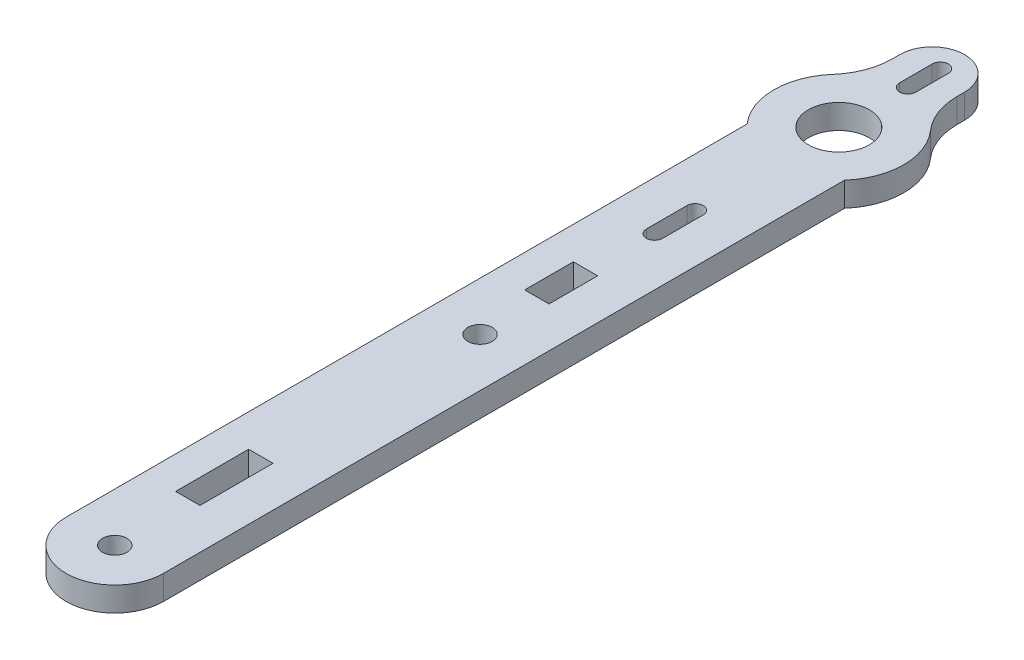
ISO-10303-21;
HEADER;
FILE_DESCRIPTION(('STEP AP214'),'2;1');
FILE_NAME('part.step','',(''),(''),'','','');
FILE_SCHEMA(('AUTOMOTIVE_DESIGN { 1 0 10303 214 1 1 1 1 }'));
ENDSEC;
DATA;
#1=APPLICATION_CONTEXT('core data for automotive mechanical design processes');
#2=APPLICATION_PROTOCOL_DEFINITION('international standard','automotive_design',2000,#1);
#3=PRODUCT_CONTEXT('',#1,'mechanical');
#4=PRODUCT('Part','Part','',(#3));
#5=PRODUCT_RELATED_PRODUCT_CATEGORY('part','',(#4));
#6=PRODUCT_DEFINITION_FORMATION('','',#4);
#7=PRODUCT_DEFINITION_CONTEXT('part definition',#1,'design');
#8=PRODUCT_DEFINITION('design','',#6,#7);
#9=PRODUCT_DEFINITION_SHAPE('','',#8);
#10=(LENGTH_UNIT() NAMED_UNIT(*) SI_UNIT(.MILLI.,.METRE.));
#11=(NAMED_UNIT(*) PLANE_ANGLE_UNIT() SI_UNIT($,.RADIAN.));
#12=(NAMED_UNIT(*) SI_UNIT($,.STERADIAN.) SOLID_ANGLE_UNIT());
#13=UNCERTAINTY_MEASURE_WITH_UNIT(LENGTH_MEASURE(1.E-05),#10,'distance_accuracy_value','');
#14=(GEOMETRIC_REPRESENTATION_CONTEXT(3) GLOBAL_UNCERTAINTY_ASSIGNED_CONTEXT((#13)) GLOBAL_UNIT_ASSIGNED_CONTEXT((#10,
#11,#12)) REPRESENTATION_CONTEXT('',''));
#15=CARTESIAN_POINT('',(0.,0.,0.));
#16=DIRECTION('',(0.,0.,1.));
#17=DIRECTION('',(1.,0.,0.));
#18=AXIS2_PLACEMENT_3D('',#15,#16,#17);
#19=CARTESIAN_POINT('',(41771.5434983321,-384.086973236419,-38.3525222447608));
#20=DIRECTION('',(0.,1.,0.));
#21=DIRECTION('',(1.,0.,0.));
#22=AXIS2_PLACEMENT_3D('',#19,#20,#21);
#23=PLANE('',#22);
#24=DIRECTION('',(1.,0.,0.));
#25=VECTOR('',#24,1.);
#26=CARTESIAN_POINT('',(41769.5434985452,-384.086973236419,-1.64747774554197));
#27=LINE('',#26,#25);
#28=CARTESIAN_POINT('',(41769.5434985452,-384.086973236419,-1.64747774554197));
#29=VERTEX_POINT('',#28);
#30=CARTESIAN_POINT('',(41772.5434985452,-384.086973236419,-1.64747774554197));
#31=VERTEX_POINT('',#30);
#32=EDGE_CURVE('E286',#29,#31,#27,.T.);
#33=ORIENTED_EDGE('',*,*,#32,.F.);
#34=DIRECTION('',(0.,0.,1.));
#35=VECTOR('',#34,1.);
#36=CARTESIAN_POINT('',(41769.5434985452,-384.086973236419,-7.64747774554198));
#37=LINE('',#36,#35);
#38=CARTESIAN_POINT('',(41769.5434985452,-384.086973236419,-7.64747774554198));
#39=VERTEX_POINT('',#38);
#40=EDGE_CURVE('E284',#39,#29,#37,.T.);
#41=ORIENTED_EDGE('',*,*,#40,.F.);
#42=DIRECTION('',(-1.,0.,0.));
#43=VECTOR('',#42,1.);
#44=CARTESIAN_POINT('',(41769.5434985452,-384.086973236419,-7.64747774554198));
#45=LINE('',#44,#43);
#46=CARTESIAN_POINT('',(41772.5434985452,-384.086973236419,-7.64747774554198));
#47=VERTEX_POINT('',#46);
#48=EDGE_CURVE('E292',#47,#39,#45,.T.);
#49=ORIENTED_EDGE('',*,*,#48,.F.);
#50=DIRECTION('',(0.,0.,-1.));
#51=VECTOR('',#50,1.);
#52=CARTESIAN_POINT('',(41772.5434985452,-384.086973236419,-7.64747774554198));
#53=LINE('',#52,#51);
#54=EDGE_CURVE('E289',#31,#47,#53,.T.);
#55=ORIENTED_EDGE('',*,*,#54,.F.);
#56=EDGE_LOOP('',(#33,#41,#49,#55));
#57=FACE_BOUND('',#56,.T.);
#58=CARTESIAN_POINT('',(41771.5434985452,-384.086973236419,5.85252225445804));
#59=DIRECTION('',(0.,1.,0.));
#60=DIRECTION('',(1.,0.,0.));
#61=AXIS2_PLACEMENT_3D('',#58,#59,#60);
#62=CIRCLE('',#61,1.50000000000176);
#63=CARTESIAN_POINT('',(41773.0434985452,-384.086973236419,5.85252225445804));
#64=VERTEX_POINT('',#63);
#65=EDGE_CURVE('E315',#64,#64,#62,.T.);
#66=ORIENTED_EDGE('',*,*,#65,.F.);
#67=EDGE_LOOP('',(#66));
#68=FACE_BOUND('',#67,.T.);
#69=CARTESIAN_POINT('',(41771.5434983321,-384.086973236419,-38.3525222447608));
#70=DIRECTION('',(0.,1.,0.));
#71=DIRECTION('',(1.,0.,0.));
#72=AXIS2_PLACEMENT_3D('',#69,#70,#71);
#73=CIRCLE('',#72,7.99999999999923);
#74=CARTESIAN_POINT('',(41777.5434984031,-384.086973236419,-33.0610197031537));
#75=VERTEX_POINT('',#74);
#76=CARTESIAN_POINT('',(41777.5434983322,-384.086973236419,-43.6440248667926));
#77=VERTEX_POINT('',#76);
#78=EDGE_CURVE('E358',#75,#77,#73,.T.);
#79=ORIENTED_EDGE('',*,*,#78,.T.);
#80=CARTESIAN_POINT('',(41783.5434981902,-384.086973236419,-48.93552764972));
#81=DIRECTION('',(0.,-1.,0.));
#82=DIRECTION('',(1.,0.,0.));
#83=AXIS2_PLACEMENT_3D('',#80,#81,#82);
#84=CIRCLE('',#83,7.99999999988875);
#85=CARTESIAN_POINT('',(41775.5434981904,-384.086973236419,-48.93552764972));
#86=VERTEX_POINT('',#85);
#87=EDGE_CURVE('E361',#77,#86,#84,.T.);
#88=ORIENTED_EDGE('',*,*,#87,.T.);
#89=DIRECTION('',(0.,0.,-1.));
#90=VECTOR('',#89,1.);
#91=CARTESIAN_POINT('',(41775.5434981904,-384.086973236419,-49.8525223252341));
#92=LINE('',#91,#90);
#93=CARTESIAN_POINT('',(41775.5434981904,-384.086973236419,-49.8525223252341));
#94=VERTEX_POINT('',#93);
#95=EDGE_CURVE('E364',#86,#94,#92,.T.);
#96=ORIENTED_EDGE('',*,*,#95,.T.);
#97=CARTESIAN_POINT('',(41771.5434982611,-384.086973236419,-49.8525223252377));
#98=DIRECTION('',(0.,1.,0.));
#99=DIRECTION('',(1.,0.,0.));
#100=AXIS2_PLACEMENT_3D('',#97,#98,#99);
#101=CIRCLE('',#100,3.99999992922062);
#102=CARTESIAN_POINT('',(41767.5434983319,-384.086973236419,-49.8525223252365));
#103=VERTEX_POINT('',#102);
#104=EDGE_CURVE('E366',#94,#103,#101,.T.);
#105=ORIENTED_EDGE('',*,*,#104,.T.);
#106=DIRECTION('',(0.,0.,1.));
#107=VECTOR('',#106,1.);
#108=CARTESIAN_POINT('',(41767.5434983319,-384.086973236419,-49.8525223252365));
#109=LINE('',#108,#107);
#110=CARTESIAN_POINT('',(41767.5434983319,-384.086973236419,-48.9355274887472));
#111=VERTEX_POINT('',#110);
#112=EDGE_CURVE('E368',#103,#111,#109,.T.);
#113=ORIENTED_EDGE('',*,*,#112,.T.);
#114=CARTESIAN_POINT('',(41759.543498332,-384.086973236419,-48.9355274887472));
#115=DIRECTION('',(0.,-1.,0.));
#116=DIRECTION('',(1.,0.,0.));
#117=AXIS2_PLACEMENT_3D('',#114,#115,#116);
#118=CIRCLE('',#117,7.99999999988322);
#119=CARTESIAN_POINT('',(41765.543498332,-384.086973236419,-43.6440248667936));
#120=VERTEX_POINT('',#119);
#121=EDGE_CURVE('E370',#111,#120,#118,.T.);
#122=ORIENTED_EDGE('',*,*,#121,.T.);
#123=CARTESIAN_POINT('',(41771.5434983321,-384.086973236419,-38.3525222447608));
#124=DIRECTION('',(0.,1.,0.));
#125=DIRECTION('',(1.,0.,0.));
#126=AXIS2_PLACEMENT_3D('',#123,#124,#125);
#127=CIRCLE('',#126,8.00000000000058);
#128=CARTESIAN_POINT('',(41765.5434984031,-384.086973236419,-33.0610195421103));
#129=VERTEX_POINT('',#128);
#130=EDGE_CURVE('E372',#120,#129,#127,.T.);
#131=ORIENTED_EDGE('',*,*,#130,.T.);
#132=DIRECTION('',(5.08053446831742E-13,0.,1.));
#133=VECTOR('',#132,1.);
#134=CARTESIAN_POINT('',(41765.5434984031,-384.086973236419,-33.0610195421103));
#135=LINE('',#134,#133);
#136=CARTESIAN_POINT('',(41765.5434984031,-384.086973236419,50.852522254458));
#137=VERTEX_POINT('',#136);
#138=EDGE_CURVE('E374',#129,#137,#135,.T.);
#139=ORIENTED_EDGE('',*,*,#138,.T.);
#140=CARTESIAN_POINT('',(41771.5434984031,-384.086973236419,50.852522254458));
#141=DIRECTION('',(0.,1.,0.));
#142=DIRECTION('',(1.,0.,0.));
#143=AXIS2_PLACEMENT_3D('',#140,#141,#142);
#144=CIRCLE('',#143,6.00000000000023);
#145=CARTESIAN_POINT('',(41777.5434984032,-384.086973236419,50.852522254458));
#146=VERTEX_POINT('',#145);
#147=EDGE_CURVE('E376',#137,#146,#144,.T.);
#148=ORIENTED_EDGE('',*,*,#147,.T.);
#149=DIRECTION('',(-5.08053445856707E-13,0.,-1.));
#150=VECTOR('',#149,1.);
#151=CARTESIAN_POINT('',(41777.5434984031,-384.086973236419,-33.0610197031537));
#152=LINE('',#151,#150);
#153=EDGE_CURVE('E378',#146,#75,#152,.T.);
#154=ORIENTED_EDGE('',*,*,#153,.T.);
#155=EDGE_LOOP('',(#79,#88,#96,#105,#113,#122,#131,#139,#148,#154));
#156=FACE_BOUND('',#155,.T.);
#157=CARTESIAN_POINT('',(41771.5434984031,-384.086973236419,50.852522254458));
#158=DIRECTION('',(0.,1.,0.));
#159=DIRECTION('',(1.,0.,0.));
#160=AXIS2_PLACEMENT_3D('',#157,#158,#159);
#161=CIRCLE('',#160,1.50000000000178);
#162=CARTESIAN_POINT('',(41773.0434984031,-384.086973236419,50.852522254458));
#163=VERTEX_POINT('',#162);
#164=EDGE_CURVE('E352',#163,#163,#161,.T.);
#165=ORIENTED_EDGE('',*,*,#164,.F.);
#166=EDGE_LOOP('',(#165));
#167=FACE_BOUND('',#166,.T.);
#168=DIRECTION('',(1.77635683940025E-12,0.,1.));
#169=VECTOR('',#168,1.);
#170=CARTESIAN_POINT('',(41770.5434982611,-384.086973236419,-50.8525223252341));
#171=LINE('',#170,#169);
#172=CARTESIAN_POINT('',(41770.5434982611,-384.086973236419,-50.8525223252341));
#173=VERTEX_POINT('',#172);
#174=CARTESIAN_POINT('',(41770.5434982611,-384.086973236419,-46.8525223252341));
#175=VERTEX_POINT('',#174);
#176=EDGE_CURVE('E323',#173,#175,#171,.T.);
#177=ORIENTED_EDGE('',*,*,#176,.F.);
#178=CARTESIAN_POINT('',(41771.5434982611,-384.086973236419,-50.8525223252341));
#179=DIRECTION('',(0.,1.,0.));
#180=DIRECTION('',(1.,0.,0.));
#181=AXIS2_PLACEMENT_3D('',#178,#179,#180);
#182=CIRCLE('',#181,1.00000000000122);
#183=CARTESIAN_POINT('',(41772.5434982611,-384.086973236419,-50.8525223252341));
#184=VERTEX_POINT('',#183);
#185=EDGE_CURVE('E321',#184,#173,#182,.T.);
#186=ORIENTED_EDGE('',*,*,#185,.F.);
#187=DIRECTION('',(0.,0.,-1.));
#188=VECTOR('',#187,1.);
#189=CARTESIAN_POINT('',(41772.5434982611,-384.086973236419,-50.8525223252341));
#190=LINE('',#189,#188);
#191=CARTESIAN_POINT('',(41772.5434982611,-384.086973236419,-46.8525223252341));
#192=VERTEX_POINT('',#191);
#193=EDGE_CURVE('E329',#192,#184,#190,.T.);
#194=ORIENTED_EDGE('',*,*,#193,.F.);
#195=CARTESIAN_POINT('',(41771.5434982611,-384.086973236419,-46.8525223252341));
#196=DIRECTION('',(0.,1.,0.));
#197=DIRECTION('',(1.,0.,0.));
#198=AXIS2_PLACEMENT_3D('',#195,#196,#197);
#199=CIRCLE('',#198,0.999999999997669);
#200=EDGE_CURVE('E326',#175,#192,#199,.T.);
#201=ORIENTED_EDGE('',*,*,#200,.F.);
#202=EDGE_LOOP('',(#177,#186,#194,#201));
#203=FACE_BOUND('',#202,.T.);
#204=CARTESIAN_POINT('',(41771.5434983321,-384.086973236419,-38.3525222447608));
#205=DIRECTION('',(0.,1.,0.));
#206=DIRECTION('',(1.,0.,0.));
#207=AXIS2_PLACEMENT_3D('',#204,#205,#206);
#208=CIRCLE('',#207,3.74999999999396);
#209=CARTESIAN_POINT('',(41775.2934983321,-384.086973236419,-38.3525222447608));
#210=VERTEX_POINT('',#209);
#211=EDGE_CURVE('E278',#210,#210,#208,.T.);
#212=ORIENTED_EDGE('',*,*,#211,.F.);
#213=EDGE_LOOP('',(#212));
#214=FACE_BOUND('',#213,.T.);
#215=DIRECTION('',(0.,0.,1.));
#216=VECTOR('',#215,1.);
#217=CARTESIAN_POINT('',(41770.5434985452,-384.086973236419,-20.647477745542));
#218=LINE('',#217,#216);
#219=CARTESIAN_POINT('',(41770.5434985452,-384.086973236419,-20.647477745542));
#220=VERTEX_POINT('',#219);
#221=CARTESIAN_POINT('',(41770.5434985452,-384.086973236419,-15.647477745542));
#222=VERTEX_POINT('',#221);
#223=EDGE_CURVE('E249',#220,#222,#218,.T.);
#224=ORIENTED_EDGE('',*,*,#223,.F.);
#225=CARTESIAN_POINT('',(41771.5434985452,-384.086973236419,-20.647477745542));
#226=DIRECTION('',(0.,1.,0.));
#227=DIRECTION('',(1.,0.,0.));
#228=AXIS2_PLACEMENT_3D('',#225,#226,#227);
#229=CIRCLE('',#228,0.999999999997669);
#230=CARTESIAN_POINT('',(41772.5434985452,-384.086973236419,-20.647477745542));
#231=VERTEX_POINT('',#230);
#232=EDGE_CURVE('E247',#231,#220,#229,.T.);
#233=ORIENTED_EDGE('',*,*,#232,.F.);
#234=DIRECTION('',(0.,0.,-1.));
#235=VECTOR('',#234,1.);
#236=CARTESIAN_POINT('',(41772.5434985452,-384.086973236419,-20.647477745542));
#237=LINE('',#236,#235);
#238=CARTESIAN_POINT('',(41772.5434985452,-384.086973236419,-15.647477745542));
#239=VERTEX_POINT('',#238);
#240=EDGE_CURVE('E255',#239,#231,#237,.T.);
#241=ORIENTED_EDGE('',*,*,#240,.F.);
#242=CARTESIAN_POINT('',(41771.5434985452,-384.086973236419,-15.647477745542));
#243=DIRECTION('',(0.,1.,0.));
#244=DIRECTION('',(1.,0.,0.));
#245=AXIS2_PLACEMENT_3D('',#242,#243,#244);
#246=CIRCLE('',#245,0.999999999997669);
#247=EDGE_CURVE('E252',#222,#239,#246,.T.);
#248=ORIENTED_EDGE('',*,*,#247,.F.);
#249=EDGE_LOOP('',(#224,#233,#241,#248));
#250=FACE_BOUND('',#249,.T.);
#251=DIRECTION('',(1.,0.,0.));
#252=VECTOR('',#251,1.);
#253=CARTESIAN_POINT('',(41769.5434985452,-384.086973236419,41.352522254458));
#254=LINE('',#253,#252);
#255=CARTESIAN_POINT('',(41769.5434985452,-384.086973236419,41.352522254458));
#256=VERTEX_POINT('',#255);
#257=CARTESIAN_POINT('',(41772.5434985452,-384.086973236419,41.352522254458));
#258=VERTEX_POINT('',#257);
#259=EDGE_CURVE('E219',#256,#258,#254,.T.);
#260=ORIENTED_EDGE('',*,*,#259,.F.);
#261=DIRECTION('',(0.,0.,1.));
#262=VECTOR('',#261,1.);
#263=CARTESIAN_POINT('',(41769.5434985452,-384.086973236419,32.3525222544581));
#264=LINE('',#263,#262);
#265=CARTESIAN_POINT('',(41769.5434985452,-384.086973236419,32.3525222544581));
#266=VERTEX_POINT('',#265);
#267=EDGE_CURVE('E211',#266,#256,#264,.T.);
#268=ORIENTED_EDGE('',*,*,#267,.F.);
#269=DIRECTION('',(-1.,0.,0.));
#270=VECTOR('',#269,1.);
#271=CARTESIAN_POINT('',(41769.5434985452,-384.086973236419,32.3525222544581));
#272=LINE('',#271,#270);
#273=CARTESIAN_POINT('',(41772.5434985452,-384.086973236419,32.3525222544581));
#274=VERTEX_POINT('',#273);
#275=EDGE_CURVE('E233',#274,#266,#272,.T.);
#276=ORIENTED_EDGE('',*,*,#275,.F.);
#277=DIRECTION('',(0.,0.,-1.));
#278=VECTOR('',#277,1.);
#279=CARTESIAN_POINT('',(41772.5434985452,-384.086973236419,32.3525222544581));
#280=LINE('',#279,#278);
#281=EDGE_CURVE('E231',#258,#274,#280,.T.);
#282=ORIENTED_EDGE('',*,*,#281,.F.);
#283=EDGE_LOOP('',(#260,#268,#276,#282));
#284=FACE_BOUND('',#283,.T.);
#285=ADVANCED_FACE('F38',(#57,#68,#156,#167,#203,#214,#250,#284),#23,.T.);
#286=CARTESIAN_POINT('',(41771.5434983321,-387.086973236419,-38.3525222447608));
#287=DIRECTION('',(0.,1.,0.));
#288=DIRECTION('',(1.,0.,0.));
#289=AXIS2_PLACEMENT_3D('',#286,#287,#288);
#290=PLANE('',#289);
#291=CARTESIAN_POINT('',(41771.5434985452,-387.086973236419,-20.647477745542));
#292=DIRECTION('',(0.,1.,0.));
#293=DIRECTION('',(1.,0.,0.));
#294=AXIS2_PLACEMENT_3D('',#291,#292,#293);
#295=CIRCLE('',#294,0.999999999997669);
#296=CARTESIAN_POINT('',(41772.5434985452,-387.086973236419,-20.6474777455419));
#297=VERTEX_POINT('',#296);
#298=CARTESIAN_POINT('',(41770.5434985452,-387.086973236419,-20.647477745542));
#299=VERTEX_POINT('',#298);
#300=EDGE_CURVE('E227',#297,#299,#295,.T.);
#301=ORIENTED_EDGE('',*,*,#300,.T.);
#302=DIRECTION('',(0.,0.,1.));
#303=VECTOR('',#302,1.);
#304=CARTESIAN_POINT('',(41770.5434985452,-387.086973236419,-20.647477745542));
#305=LINE('',#304,#303);
#306=CARTESIAN_POINT('',(41770.5434985452,-387.086973236419,-15.647477745542));
#307=VERTEX_POINT('',#306);
#308=EDGE_CURVE('E260',#299,#307,#305,.T.);
#309=ORIENTED_EDGE('',*,*,#308,.T.);
#310=CARTESIAN_POINT('',(41771.5434985452,-387.086973236419,-15.647477745542));
#311=DIRECTION('',(0.,1.,0.));
#312=DIRECTION('',(1.,0.,0.));
#313=AXIS2_PLACEMENT_3D('',#310,#311,#312);
#314=CIRCLE('',#313,0.999999999997669);
#315=CARTESIAN_POINT('',(41772.5434985452,-387.086973236419,-15.647477745542));
#316=VERTEX_POINT('',#315);
#317=EDGE_CURVE('E263',#307,#316,#314,.T.);
#318=ORIENTED_EDGE('',*,*,#317,.T.);
#319=DIRECTION('',(0.,0.,-1.));
#320=VECTOR('',#319,1.);
#321=CARTESIAN_POINT('',(41772.5434985452,-387.086973236419,-20.647477745542));
#322=LINE('',#321,#320);
#323=EDGE_CURVE('E250',#316,#297,#322,.T.);
#324=ORIENTED_EDGE('',*,*,#323,.T.);
#325=EDGE_LOOP('',(#301,#309,#318,#324));
#326=FACE_BOUND('',#325,.T.);
#327=CARTESIAN_POINT('',(41771.5434985452,-387.086973236419,5.85252225445804));
#328=DIRECTION('',(0.,1.,0.));
#329=DIRECTION('',(1.,0.,0.));
#330=AXIS2_PLACEMENT_3D('',#327,#328,#329);
#331=CIRCLE('',#330,1.50000000000176);
#332=CARTESIAN_POINT('',(41773.0434985452,-387.086973236419,5.85252225445804));
#333=VERTEX_POINT('',#332);
#334=EDGE_CURVE('E314',#333,#333,#331,.T.);
#335=ORIENTED_EDGE('',*,*,#334,.T.);
#336=EDGE_LOOP('',(#335));
#337=FACE_BOUND('',#336,.T.);
#338=CARTESIAN_POINT('',(41771.5434982611,-387.086973236419,-50.8525223252341));
#339=DIRECTION('',(0.,1.,0.));
#340=DIRECTION('',(1.,0.,0.));
#341=AXIS2_PLACEMENT_3D('',#338,#339,#340);
#342=CIRCLE('',#341,1.00000000000122);
#343=CARTESIAN_POINT('',(41772.5434982611,-387.086973236419,-50.8525223252341));
#344=VERTEX_POINT('',#343);
#345=CARTESIAN_POINT('',(41770.5434982611,-387.086973236419,-50.8525223252341));
#346=VERTEX_POINT('',#345);
#347=EDGE_CURVE('E318',#344,#346,#342,.T.);
#348=ORIENTED_EDGE('',*,*,#347,.T.);
#349=DIRECTION('',(1.77635683940025E-12,0.,1.));
#350=VECTOR('',#349,1.);
#351=CARTESIAN_POINT('',(41770.5434982611,-387.086973236419,-50.8525223252341));
#352=LINE('',#351,#350);
#353=CARTESIAN_POINT('',(41770.5434982611,-387.086973236419,-46.8525223252341));
#354=VERTEX_POINT('',#353);
#355=EDGE_CURVE('E334',#346,#354,#352,.T.);
#356=ORIENTED_EDGE('',*,*,#355,.T.);
#357=CARTESIAN_POINT('',(41771.5434982611,-387.086973236419,-46.8525223252341));
#358=DIRECTION('',(0.,1.,0.));
#359=DIRECTION('',(1.,0.,0.));
#360=AXIS2_PLACEMENT_3D('',#357,#358,#359);
#361=CIRCLE('',#360,0.999999999997669);
#362=CARTESIAN_POINT('',(41772.5434982611,-387.086973236419,-46.8525223252341));
#363=VERTEX_POINT('',#362);
#364=EDGE_CURVE('E337',#354,#363,#361,.T.);
#365=ORIENTED_EDGE('',*,*,#364,.T.);
#366=DIRECTION('',(0.,0.,-1.));
#367=VECTOR('',#366,1.);
#368=CARTESIAN_POINT('',(41772.5434982611,-387.086973236419,-50.8525223252341));
#369=LINE('',#368,#367);
#370=EDGE_CURVE('E324',#363,#344,#369,.T.);
#371=ORIENTED_EDGE('',*,*,#370,.T.);
#372=EDGE_LOOP('',(#348,#356,#365,#371));
#373=FACE_BOUND('',#372,.T.);
#374=CARTESIAN_POINT('',(41771.5434983321,-387.086973236419,-38.3525222447608));
#375=DIRECTION('',(0.,1.,0.));
#376=DIRECTION('',(1.,0.,0.));
#377=AXIS2_PLACEMENT_3D('',#374,#375,#376);
#378=CIRCLE('',#377,7.99999999999923);
#379=CARTESIAN_POINT('',(41777.5434984031,-387.086973236419,-33.0610197031537));
#380=VERTEX_POINT('',#379);
#381=CARTESIAN_POINT('',(41777.5434983322,-387.086973236419,-43.6440248667926));
#382=VERTEX_POINT('',#381);
#383=EDGE_CURVE('E355',#380,#382,#378,.T.);
#384=ORIENTED_EDGE('',*,*,#383,.F.);
#385=DIRECTION('',(-5.08053445856707E-13,0.,-1.));
#386=VECTOR('',#385,1.);
#387=CARTESIAN_POINT('',(41777.5434984031,-387.086973236419,-33.0610197031537));
#388=LINE('',#387,#386);
#389=CARTESIAN_POINT('',(41777.5434984032,-387.086973236419,50.852522254458));
#390=VERTEX_POINT('',#389);
#391=EDGE_CURVE('E362',#390,#380,#388,.T.);
#392=ORIENTED_EDGE('',*,*,#391,.F.);
#393=CARTESIAN_POINT('',(41771.5434984031,-387.086973236419,50.852522254458));
#394=DIRECTION('',(0.,1.,0.));
#395=DIRECTION('',(1.,0.,0.));
#396=AXIS2_PLACEMENT_3D('',#393,#394,#395);
#397=CIRCLE('',#396,6.00000000000023);
#398=CARTESIAN_POINT('',(41765.5434984031,-387.086973236419,50.852522254458));
#399=VERTEX_POINT('',#398);
#400=EDGE_CURVE('E397',#399,#390,#397,.T.);
#401=ORIENTED_EDGE('',*,*,#400,.F.);
#402=DIRECTION('',(5.08053446831742E-13,0.,1.));
#403=VECTOR('',#402,1.);
#404=CARTESIAN_POINT('',(41765.5434984031,-387.086973236419,-33.0610195421103));
#405=LINE('',#404,#403);
#406=CARTESIAN_POINT('',(41765.5434984031,-387.086973236419,-33.0610195421103));
#407=VERTEX_POINT('',#406);
#408=EDGE_CURVE('E395',#407,#399,#405,.T.);
#409=ORIENTED_EDGE('',*,*,#408,.F.);
#410=CARTESIAN_POINT('',(41771.5434983321,-387.086973236419,-38.3525222447608));
#411=DIRECTION('',(0.,1.,0.));
#412=DIRECTION('',(1.,0.,0.));
#413=AXIS2_PLACEMENT_3D('',#410,#411,#412);
#414=CIRCLE('',#413,8.00000000000058);
#415=CARTESIAN_POINT('',(41765.543498332,-387.086973236419,-43.6440248667936));
#416=VERTEX_POINT('',#415);
#417=EDGE_CURVE('E393',#416,#407,#414,.T.);
#418=ORIENTED_EDGE('',*,*,#417,.F.);
#419=CARTESIAN_POINT('',(41759.543498332,-387.086973236419,-48.9355274887472));
#420=DIRECTION('',(0.,-1.,0.));
#421=DIRECTION('',(1.,0.,0.));
#422=AXIS2_PLACEMENT_3D('',#419,#420,#421);
#423=CIRCLE('',#422,7.99999999988322);
#424=CARTESIAN_POINT('',(41767.5434983319,-387.086973236419,-48.9355274887472));
#425=VERTEX_POINT('',#424);
#426=EDGE_CURVE('E391',#425,#416,#423,.T.);
#427=ORIENTED_EDGE('',*,*,#426,.F.);
#428=DIRECTION('',(0.,0.,1.));
#429=VECTOR('',#428,1.);
#430=CARTESIAN_POINT('',(41767.5434983319,-387.086973236419,-49.8525223252365));
#431=LINE('',#430,#429);
#432=CARTESIAN_POINT('',(41767.5434983319,-387.086973236419,-49.8525223252365));
#433=VERTEX_POINT('',#432);
#434=EDGE_CURVE('E389',#433,#425,#431,.T.);
#435=ORIENTED_EDGE('',*,*,#434,.F.);
#436=CARTESIAN_POINT('',(41771.5434982611,-387.086973236419,-49.8525223252377));
#437=DIRECTION('',(0.,1.,0.));
#438=DIRECTION('',(1.,0.,0.));
#439=AXIS2_PLACEMENT_3D('',#436,#437,#438);
#440=CIRCLE('',#439,3.99999992922062);
#441=CARTESIAN_POINT('',(41775.5434981904,-387.086973236419,-49.8525223252341));
#442=VERTEX_POINT('',#441);
#443=EDGE_CURVE('E387',#442,#433,#440,.T.);
#444=ORIENTED_EDGE('',*,*,#443,.F.);
#445=DIRECTION('',(0.,0.,-1.));
#446=VECTOR('',#445,1.);
#447=CARTESIAN_POINT('',(41775.5434981904,-387.086973236419,-49.8525223252341));
#448=LINE('',#447,#446);
#449=CARTESIAN_POINT('',(41775.5434981904,-387.086973236419,-48.93552764972));
#450=VERTEX_POINT('',#449);
#451=EDGE_CURVE('E385',#450,#442,#448,.T.);
#452=ORIENTED_EDGE('',*,*,#451,.F.);
#453=CARTESIAN_POINT('',(41783.5434981902,-387.086973236419,-48.93552764972));
#454=DIRECTION('',(0.,-1.,0.));
#455=DIRECTION('',(1.,0.,0.));
#456=AXIS2_PLACEMENT_3D('',#453,#454,#455);
#457=CIRCLE('',#456,7.99999999988875);
#458=EDGE_CURVE('E383',#382,#450,#457,.T.);
#459=ORIENTED_EDGE('',*,*,#458,.F.);
#460=EDGE_LOOP('',(#384,#392,#401,#409,#418,#427,#435,#444,#452,#459));
#461=FACE_BOUND('',#460,.T.);
#462=CARTESIAN_POINT('',(41771.5434984031,-387.086973236419,50.852522254458));
#463=DIRECTION('',(0.,1.,0.));
#464=DIRECTION('',(1.,0.,0.));
#465=AXIS2_PLACEMENT_3D('',#462,#463,#464);
#466=CIRCLE('',#465,1.50000000000178);
#467=CARTESIAN_POINT('',(41773.0434984031,-387.086973236419,50.852522254458));
#468=VERTEX_POINT('',#467);
#469=EDGE_CURVE('E351',#468,#468,#466,.T.);
#470=ORIENTED_EDGE('',*,*,#469,.T.);
#471=EDGE_LOOP('',(#470));
#472=FACE_BOUND('',#471,.T.);
#473=DIRECTION('',(0.,0.,1.));
#474=VECTOR('',#473,1.);
#475=CARTESIAN_POINT('',(41769.5434985452,-387.086973236419,-7.64747774554198));
#476=LINE('',#475,#474);
#477=CARTESIAN_POINT('',(41769.5434985452,-387.086973236419,-7.64747774554198));
#478=VERTEX_POINT('',#477);
#479=CARTESIAN_POINT('',(41769.5434985452,-387.086973236419,-1.64747774554197));
#480=VERTEX_POINT('',#479);
#481=EDGE_CURVE('E281',#478,#480,#476,.T.);
#482=ORIENTED_EDGE('',*,*,#481,.T.);
#483=DIRECTION('',(1.,0.,0.));
#484=VECTOR('',#483,1.);
#485=CARTESIAN_POINT('',(41769.5434985452,-387.086973236419,-1.64747774554197));
#486=LINE('',#485,#484);
#487=CARTESIAN_POINT('',(41772.5434985452,-387.086973236419,-1.64747774554197));
#488=VERTEX_POINT('',#487);
#489=EDGE_CURVE('E297',#480,#488,#486,.T.);
#490=ORIENTED_EDGE('',*,*,#489,.T.);
#491=DIRECTION('',(0.,0.,-1.));
#492=VECTOR('',#491,1.);
#493=CARTESIAN_POINT('',(41772.5434985452,-387.086973236419,-7.64747774554198));
#494=LINE('',#493,#492);
#495=CARTESIAN_POINT('',(41772.5434985452,-387.086973236419,-7.64747774554198));
#496=VERTEX_POINT('',#495);
#497=EDGE_CURVE('E300',#488,#496,#494,.T.);
#498=ORIENTED_EDGE('',*,*,#497,.T.);
#499=DIRECTION('',(-1.,0.,0.));
#500=VECTOR('',#499,1.);
#501=CARTESIAN_POINT('',(41769.5434985452,-387.086973236419,-7.64747774554198));
#502=LINE('',#501,#500);
#503=EDGE_CURVE('E287',#496,#478,#502,.T.);
#504=ORIENTED_EDGE('',*,*,#503,.T.);
#505=EDGE_LOOP('',(#482,#490,#498,#504));
#506=FACE_BOUND('',#505,.T.);
#507=CARTESIAN_POINT('',(41771.5434983321,-387.086973236419,-38.3525222447608));
#508=DIRECTION('',(0.,1.,0.));
#509=DIRECTION('',(1.,0.,0.));
#510=AXIS2_PLACEMENT_3D('',#507,#508,#509);
#511=CIRCLE('',#510,3.74999999999396);
#512=CARTESIAN_POINT('',(41775.2934983321,-387.086973236419,-38.3525222447608));
#513=VERTEX_POINT('',#512);
#514=EDGE_CURVE('E277',#513,#513,#511,.T.);
#515=ORIENTED_EDGE('',*,*,#514,.T.);
#516=EDGE_LOOP('',(#515));
#517=FACE_BOUND('',#516,.T.);
#518=DIRECTION('',(0.,0.,1.));
#519=VECTOR('',#518,1.);
#520=CARTESIAN_POINT('',(41769.5434985452,-387.086973236419,32.3525222544581));
#521=LINE('',#520,#519);
#522=CARTESIAN_POINT('',(41769.5434985452,-387.086973236419,32.3525222544581));
#523=VERTEX_POINT('',#522);
#524=CARTESIAN_POINT('',(41769.5434985452,-387.086973236419,41.352522254458));
#525=VERTEX_POINT('',#524);
#526=EDGE_CURVE('E61',#523,#525,#521,.T.);
#527=ORIENTED_EDGE('',*,*,#526,.T.);
#528=DIRECTION('',(1.,0.,0.));
#529=VECTOR('',#528,1.);
#530=CARTESIAN_POINT('',(41769.5434985452,-387.086973236419,41.352522254458));
#531=LINE('',#530,#529);
#532=CARTESIAN_POINT('',(41772.5434985452,-387.086973236419,41.352522254458));
#533=VERTEX_POINT('',#532);
#534=EDGE_CURVE('E226',#525,#533,#531,.T.);
#535=ORIENTED_EDGE('',*,*,#534,.T.);
#536=DIRECTION('',(0.,0.,-1.));
#537=VECTOR('',#536,1.);
#538=CARTESIAN_POINT('',(41772.5434985452,-387.086973236419,32.3525222544581));
#539=LINE('',#538,#537);
#540=CARTESIAN_POINT('',(41772.5434985452,-387.086973236419,32.3525222544581));
#541=VERTEX_POINT('',#540);
#542=EDGE_CURVE('E239',#533,#541,#539,.T.);
#543=ORIENTED_EDGE('',*,*,#542,.T.);
#544=DIRECTION('',(-1.,0.,0.));
#545=VECTOR('',#544,1.);
#546=CARTESIAN_POINT('',(41769.5434985452,-387.086973236419,32.3525222544581));
#547=LINE('',#546,#545);
#548=EDGE_CURVE('E220',#541,#523,#547,.T.);
#549=ORIENTED_EDGE('',*,*,#548,.T.);
#550=EDGE_LOOP('',(#527,#535,#543,#549));
#551=FACE_BOUND('',#550,.T.);
#552=ADVANCED_FACE('F433',(#326,#337,#373,#461,#472,#506,#517,#551),#290,.F.);
#553=CARTESIAN_POINT('',(41771.5434983321,-384.086973236419,-38.3525222447608));
#554=DIRECTION('',(0.,-1.,0.));
#555=DIRECTION('',(-1.,0.,0.));
#556=AXIS2_PLACEMENT_3D('',#553,#554,#555);
#557=CYLINDRICAL_SURFACE('',#556,7.99999999999923);
#558=ORIENTED_EDGE('',*,*,#383,.T.);
#559=DIRECTION('',(0.,-1.,0.));
#560=VECTOR('',#559,1.);
#561=CARTESIAN_POINT('',(41777.5434983322,-384.086973236419,-43.6440248667926));
#562=LINE('',#561,#560);
#563=EDGE_CURVE('E11',#77,#382,#562,.T.);
#564=ORIENTED_EDGE('',*,*,#563,.F.);
#565=ORIENTED_EDGE('',*,*,#78,.F.);
#566=DIRECTION('',(0.,-1.,0.));
#567=VECTOR('',#566,1.);
#568=CARTESIAN_POINT('',(41777.5434984031,-384.086973236419,-33.0610197031537));
#569=LINE('',#568,#567);
#570=EDGE_CURVE('E380',#75,#380,#569,.T.);
#571=ORIENTED_EDGE('',*,*,#570,.T.);
#572=EDGE_LOOP('',(#558,#564,#565,#571));
#573=FACE_BOUND('',#572,.T.);
#574=ADVANCED_FACE('F40',(#573),#557,.T.);
#575=CARTESIAN_POINT('',(41783.5434981902,-384.086973236419,-48.93552764972));
#576=DIRECTION('',(0.,-1.,0.));
#577=DIRECTION('',(-1.,0.,0.));
#578=AXIS2_PLACEMENT_3D('',#575,#576,#577);
#579=CYLINDRICAL_SURFACE('',#578,7.99999999988875);
#580=ORIENTED_EDGE('',*,*,#458,.T.);
#581=DIRECTION('',(0.,-1.,0.));
#582=VECTOR('',#581,1.);
#583=CARTESIAN_POINT('',(41775.5434981904,-384.086973236419,-48.93552764972));
#584=LINE('',#583,#582);
#585=EDGE_CURVE('E46',#86,#450,#584,.T.);
#586=ORIENTED_EDGE('',*,*,#585,.F.);
#587=ORIENTED_EDGE('',*,*,#87,.F.);
#588=ORIENTED_EDGE('',*,*,#563,.T.);
#589=EDGE_LOOP('',(#580,#586,#587,#588));
#590=FACE_BOUND('',#589,.T.);
#591=ADVANCED_FACE('F451',(#590),#579,.F.);
#592=CARTESIAN_POINT('',(41775.5434981904,-384.086973236419,-49.8525223252341));
#593=DIRECTION('',(-1.,0.,0.));
#594=DIRECTION('',(0.,1.,0.));
#595=AXIS2_PLACEMENT_3D('',#592,#593,#594);
#596=PLANE('',#595);
#597=ORIENTED_EDGE('',*,*,#451,.T.);
#598=DIRECTION('',(0.,-1.,0.));
#599=VECTOR('',#598,1.);
#600=CARTESIAN_POINT('',(41775.5434981904,-384.086973236419,-49.8525223252341));
#601=LINE('',#600,#599);
#602=EDGE_CURVE('E420',#94,#442,#601,.T.);
#603=ORIENTED_EDGE('',*,*,#602,.F.);
#604=ORIENTED_EDGE('',*,*,#95,.F.);
#605=ORIENTED_EDGE('',*,*,#585,.T.);
#606=EDGE_LOOP('',(#597,#603,#604,#605));
#607=FACE_BOUND('',#606,.T.);
#608=ADVANCED_FACE('F427',(#607),#596,.F.);
#609=CARTESIAN_POINT('',(41771.5434982611,-384.086973236419,-49.8525223252377));
#610=DIRECTION('',(0.,-1.,0.));
#611=DIRECTION('',(-1.,0.,0.));
#612=AXIS2_PLACEMENT_3D('',#609,#610,#611);
#613=CYLINDRICAL_SURFACE('',#612,3.99999992922062);
#614=ORIENTED_EDGE('',*,*,#443,.T.);
#615=DIRECTION('',(0.,-1.,0.));
#616=VECTOR('',#615,1.);
#617=CARTESIAN_POINT('',(41767.5434983319,-384.086973236419,-49.8525223252365));
#618=LINE('',#617,#616);
#619=EDGE_CURVE('E417',#103,#433,#618,.T.);
#620=ORIENTED_EDGE('',*,*,#619,.F.);
#621=ORIENTED_EDGE('',*,*,#104,.F.);
#622=ORIENTED_EDGE('',*,*,#602,.T.);
#623=EDGE_LOOP('',(#614,#620,#621,#622));
#624=FACE_BOUND('',#623,.T.);
#625=ADVANCED_FACE('F439',(#624),#613,.T.);
#626=CARTESIAN_POINT('',(41767.5434983319,-384.086973236419,-49.8525223252365));
#627=DIRECTION('',(1.,0.,0.));
#628=DIRECTION('',(0.,-1.,0.));
#629=AXIS2_PLACEMENT_3D('',#626,#627,#628);
#630=PLANE('',#629);
#631=ORIENTED_EDGE('',*,*,#434,.T.);
#632=DIRECTION('',(0.,-1.,0.));
#633=VECTOR('',#632,1.);
#634=CARTESIAN_POINT('',(41767.5434983319,-384.086973236419,-48.9355274887472));
#635=LINE('',#634,#633);
#636=EDGE_CURVE('E414',#111,#425,#635,.T.);
#637=ORIENTED_EDGE('',*,*,#636,.F.);
#638=ORIENTED_EDGE('',*,*,#112,.F.);
#639=ORIENTED_EDGE('',*,*,#619,.T.);
#640=EDGE_LOOP('',(#631,#637,#638,#639));
#641=FACE_BOUND('',#640,.T.);
#642=ADVANCED_FACE('F443',(#641),#630,.F.);
#643=CARTESIAN_POINT('',(41759.543498332,-384.086973236419,-48.9355274887472));
#644=DIRECTION('',(0.,-1.,0.));
#645=DIRECTION('',(-1.,0.,0.));
#646=AXIS2_PLACEMENT_3D('',#643,#644,#645);
#647=CYLINDRICAL_SURFACE('',#646,7.99999999988322);
#648=ORIENTED_EDGE('',*,*,#426,.T.);
#649=DIRECTION('',(0.,-1.,0.));
#650=VECTOR('',#649,1.);
#651=CARTESIAN_POINT('',(41765.543498332,-384.086973236419,-43.6440248667936));
#652=LINE('',#651,#650);
#653=EDGE_CURVE('E411',#120,#416,#652,.T.);
#654=ORIENTED_EDGE('',*,*,#653,.F.);
#655=ORIENTED_EDGE('',*,*,#121,.F.);
#656=ORIENTED_EDGE('',*,*,#636,.T.);
#657=EDGE_LOOP('',(#648,#654,#655,#656));
#658=FACE_BOUND('',#657,.T.);
#659=ADVANCED_FACE('F474',(#658),#647,.F.);
#660=CARTESIAN_POINT('',(41771.5434983321,-384.086973236419,-38.3525222447608));
#661=DIRECTION('',(0.,-1.,0.));
#662=DIRECTION('',(-1.,0.,0.));
#663=AXIS2_PLACEMENT_3D('',#660,#661,#662);
#664=CYLINDRICAL_SURFACE('',#663,8.00000000000058);
#665=ORIENTED_EDGE('',*,*,#417,.T.);
#666=DIRECTION('',(0.,-1.,0.));
#667=VECTOR('',#666,1.);
#668=CARTESIAN_POINT('',(41765.5434984031,-384.086973236419,-33.0610195421103));
#669=LINE('',#668,#667);
#670=EDGE_CURVE('E408',#129,#407,#669,.T.);
#671=ORIENTED_EDGE('',*,*,#670,.F.);
#672=ORIENTED_EDGE('',*,*,#130,.F.);
#673=ORIENTED_EDGE('',*,*,#653,.T.);
#674=EDGE_LOOP('',(#665,#671,#672,#673));
#675=FACE_BOUND('',#674,.T.);
#676=ADVANCED_FACE('F471',(#675),#664,.T.);
#677=CARTESIAN_POINT('',(41765.5434984031,-384.086973236419,-33.0610195421103));
#678=DIRECTION('',(1.,0.,-5.08053446831742E-13));
#679=DIRECTION('',(-5.08053446831742E-13,0.,-1.));
#680=AXIS2_PLACEMENT_3D('',#677,#678,#679);
#681=PLANE('',#680);
#682=ORIENTED_EDGE('',*,*,#408,.T.);
#683=DIRECTION('',(0.,-1.,0.));
#684=VECTOR('',#683,1.);
#685=CARTESIAN_POINT('',(41765.5434984031,-384.086973236419,50.852522254458));
#686=LINE('',#685,#684);
#687=EDGE_CURVE('E405',#137,#399,#686,.T.);
#688=ORIENTED_EDGE('',*,*,#687,.F.);
#689=ORIENTED_EDGE('',*,*,#138,.F.);
#690=ORIENTED_EDGE('',*,*,#670,.T.);
#691=EDGE_LOOP('',(#682,#688,#689,#690));
#692=FACE_BOUND('',#691,.T.);
#693=ADVANCED_FACE('F467',(#692),#681,.F.);
#694=CARTESIAN_POINT('',(41771.5434984031,-384.086973236419,50.852522254458));
#695=DIRECTION('',(0.,-1.,0.));
#696=DIRECTION('',(-1.,0.,0.));
#697=AXIS2_PLACEMENT_3D('',#694,#695,#696);
#698=CYLINDRICAL_SURFACE('',#697,6.00000000000023);
#699=ORIENTED_EDGE('',*,*,#400,.T.);
#700=DIRECTION('',(0.,-1.,0.));
#701=VECTOR('',#700,1.);
#702=CARTESIAN_POINT('',(41777.5434984032,-384.086973236419,50.852522254458));
#703=LINE('',#702,#701);
#704=EDGE_CURVE('E402',#146,#390,#703,.T.);
#705=ORIENTED_EDGE('',*,*,#704,.F.);
#706=ORIENTED_EDGE('',*,*,#147,.F.);
#707=ORIENTED_EDGE('',*,*,#687,.T.);
#708=EDGE_LOOP('',(#699,#705,#706,#707));
#709=FACE_BOUND('',#708,.T.);
#710=ADVANCED_FACE('F463',(#709),#698,.T.);
#711=CARTESIAN_POINT('',(41777.5434984031,-384.086973236419,-33.0610197031537));
#712=DIRECTION('',(-1.,0.,5.08053445856707E-13));
#713=DIRECTION('',(5.08053445856707E-13,0.,1.));
#714=AXIS2_PLACEMENT_3D('',#711,#712,#713);
#715=PLANE('',#714);
#716=ORIENTED_EDGE('',*,*,#391,.T.);
#717=ORIENTED_EDGE('',*,*,#570,.F.);
#718=ORIENTED_EDGE('',*,*,#153,.F.);
#719=ORIENTED_EDGE('',*,*,#704,.T.);
#720=EDGE_LOOP('',(#716,#717,#718,#719));
#721=FACE_BOUND('',#720,.T.);
#722=ADVANCED_FACE('F458',(#721),#715,.F.);
#723=CARTESIAN_POINT('',(41771.5434984031,-384.086973236419,50.852522254458));
#724=DIRECTION('',(0.,-1.,0.));
#725=DIRECTION('',(-1.,0.,0.));
#726=AXIS2_PLACEMENT_3D('',#723,#724,#725);
#727=CYLINDRICAL_SURFACE('',#726,1.50000000000178);
#728=ORIENTED_EDGE('',*,*,#164,.T.);
#729=EDGE_LOOP('',(#728));
#730=FACE_BOUND('',#729,.T.);
#731=ORIENTED_EDGE('',*,*,#469,.F.);
#732=EDGE_LOOP('',(#731));
#733=FACE_BOUND('',#732,.T.);
#734=ADVANCED_FACE('F494',(#730,#733),#727,.F.);
#735=CARTESIAN_POINT('',(41771.5434982611,-384.086973236419,-50.8525223252341));
#736=DIRECTION('',(0.,-1.,0.));
#737=DIRECTION('',(-1.,0.,0.));
#738=AXIS2_PLACEMENT_3D('',#735,#736,#737);
#739=CYLINDRICAL_SURFACE('',#738,1.00000000000122);
#740=ORIENTED_EDGE('',*,*,#347,.F.);
#741=DIRECTION('',(0.,-1.,0.));
#742=VECTOR('',#741,1.);
#743=CARTESIAN_POINT('',(41772.5434982611,-384.086973236419,-50.8525223252341));
#744=LINE('',#743,#742);
#745=EDGE_CURVE('E331',#184,#344,#744,.T.);
#746=ORIENTED_EDGE('',*,*,#745,.F.);
#747=ORIENTED_EDGE('',*,*,#185,.T.);
#748=DIRECTION('',(0.,-1.,0.));
#749=VECTOR('',#748,1.);
#750=CARTESIAN_POINT('',(41770.5434982611,-384.086973236419,-50.8525223252341));
#751=LINE('',#750,#749);
#752=EDGE_CURVE('E348',#173,#346,#751,.T.);
#753=ORIENTED_EDGE('',*,*,#752,.T.);
#754=EDGE_LOOP('',(#740,#746,#747,#753));
#755=FACE_BOUND('',#754,.T.);
#756=ADVANCED_FACE('F520',(#755),#739,.F.);
#757=CARTESIAN_POINT('',(41770.5434982611,-384.086973236419,-50.8525223252341));
#758=DIRECTION('',(1.,0.,-1.77635683940025E-12));
#759=DIRECTION('',(-1.77635683940025E-12,0.,-1.));
#760=AXIS2_PLACEMENT_3D('',#757,#758,#759);
#761=PLANE('',#760);
#762=ORIENTED_EDGE('',*,*,#355,.F.);
#763=ORIENTED_EDGE('',*,*,#752,.F.);
#764=ORIENTED_EDGE('',*,*,#176,.T.);
#765=DIRECTION('',(0.,-1.,0.));
#766=VECTOR('',#765,1.);
#767=CARTESIAN_POINT('',(41770.5434982611,-384.086973236419,-46.8525223252341));
#768=LINE('',#767,#766);
#769=EDGE_CURVE('E346',#175,#354,#768,.T.);
#770=ORIENTED_EDGE('',*,*,#769,.T.);
#771=EDGE_LOOP('',(#762,#763,#764,#770));
#772=FACE_BOUND('',#771,.T.);
#773=ADVANCED_FACE('F527',(#772),#761,.T.);
#774=CARTESIAN_POINT('',(41771.5434982611,-384.086973236419,-46.8525223252341));
#775=DIRECTION('',(0.,-1.,0.));
#776=DIRECTION('',(-1.,0.,0.));
#777=AXIS2_PLACEMENT_3D('',#774,#775,#776);
#778=CYLINDRICAL_SURFACE('',#777,0.999999999997669);
#779=ORIENTED_EDGE('',*,*,#364,.F.);
#780=ORIENTED_EDGE('',*,*,#769,.F.);
#781=ORIENTED_EDGE('',*,*,#200,.T.);
#782=DIRECTION('',(0.,-1.,0.));
#783=VECTOR('',#782,1.);
#784=CARTESIAN_POINT('',(41772.5434982611,-384.086973236419,-46.8525223252341));
#785=LINE('',#784,#783);
#786=EDGE_CURVE('E344',#192,#363,#785,.T.);
#787=ORIENTED_EDGE('',*,*,#786,.T.);
#788=EDGE_LOOP('',(#779,#780,#781,#787));
#789=FACE_BOUND('',#788,.T.);
#790=ADVANCED_FACE('F534',(#789),#778,.F.);
#791=CARTESIAN_POINT('',(41772.5434982611,-384.086973236419,-50.8525223252341));
#792=DIRECTION('',(-1.,0.,0.));
#793=DIRECTION('',(0.,1.,0.));
#794=AXIS2_PLACEMENT_3D('',#791,#792,#793);
#795=PLANE('',#794);
#796=ORIENTED_EDGE('',*,*,#370,.F.);
#797=ORIENTED_EDGE('',*,*,#786,.F.);
#798=ORIENTED_EDGE('',*,*,#193,.T.);
#799=ORIENTED_EDGE('',*,*,#745,.T.);
#800=EDGE_LOOP('',(#796,#797,#798,#799));
#801=FACE_BOUND('',#800,.T.);
#802=ADVANCED_FACE('F542',(#801),#795,.T.);
#803=CARTESIAN_POINT('',(41771.5434985452,-384.086973236419,5.85252225445804));
#804=DIRECTION('',(0.,-1.,0.));
#805=DIRECTION('',(-1.,0.,0.));
#806=AXIS2_PLACEMENT_3D('',#803,#804,#805);
#807=CYLINDRICAL_SURFACE('',#806,1.50000000000176);
#808=ORIENTED_EDGE('',*,*,#65,.T.);
#809=EDGE_LOOP('',(#808));
#810=FACE_BOUND('',#809,.T.);
#811=ORIENTED_EDGE('',*,*,#334,.F.);
#812=EDGE_LOOP('',(#811));
#813=FACE_BOUND('',#812,.T.);
#814=ADVANCED_FACE('F550',(#810,#813),#807,.F.);
#815=CARTESIAN_POINT('',(41769.5434985452,-384.086973236419,-7.64747774554198));
#816=DIRECTION('',(1.,0.,0.));
#817=DIRECTION('',(0.,-1.,0.));
#818=AXIS2_PLACEMENT_3D('',#815,#816,#817);
#819=PLANE('',#818);
#820=ORIENTED_EDGE('',*,*,#481,.F.);
#821=DIRECTION('',(0.,-1.,0.));
#822=VECTOR('',#821,1.);
#823=CARTESIAN_POINT('',(41769.5434985452,-384.086973236419,-7.64747774554198));
#824=LINE('',#823,#822);
#825=EDGE_CURVE('E294',#39,#478,#824,.T.);
#826=ORIENTED_EDGE('',*,*,#825,.F.);
#827=ORIENTED_EDGE('',*,*,#40,.T.);
#828=DIRECTION('',(0.,-1.,0.));
#829=VECTOR('',#828,1.);
#830=CARTESIAN_POINT('',(41769.5434985452,-384.086973236419,-1.64747774554197));
#831=LINE('',#830,#829);
#832=EDGE_CURVE('E311',#29,#480,#831,.T.);
#833=ORIENTED_EDGE('',*,*,#832,.T.);
#834=EDGE_LOOP('',(#820,#826,#827,#833));
#835=FACE_BOUND('',#834,.T.);
#836=ADVANCED_FACE('F558',(#835),#819,.T.);
#837=CARTESIAN_POINT('',(41769.5434985452,-384.086973236419,-1.64747774554197));
#838=DIRECTION('',(0.,0.,-1.));
#839=DIRECTION('',(0.,1.,0.));
#840=AXIS2_PLACEMENT_3D('',#837,#838,#839);
#841=PLANE('',#840);
#842=ORIENTED_EDGE('',*,*,#489,.F.);
#843=ORIENTED_EDGE('',*,*,#832,.F.);
#844=ORIENTED_EDGE('',*,*,#32,.T.);
#845=DIRECTION('',(0.,-1.,0.));
#846=VECTOR('',#845,1.);
#847=CARTESIAN_POINT('',(41772.5434985452,-384.086973236419,-1.64747774554197));
#848=LINE('',#847,#846);
#849=EDGE_CURVE('E309',#31,#488,#848,.T.);
#850=ORIENTED_EDGE('',*,*,#849,.T.);
#851=EDGE_LOOP('',(#842,#843,#844,#850));
#852=FACE_BOUND('',#851,.T.);
#853=ADVANCED_FACE('F566',(#852),#841,.T.);
#854=CARTESIAN_POINT('',(41772.5434985452,-384.086973236419,-7.64747774554198));
#855=DIRECTION('',(-1.,0.,0.));
#856=DIRECTION('',(0.,1.,0.));
#857=AXIS2_PLACEMENT_3D('',#854,#855,#856);
#858=PLANE('',#857);
#859=ORIENTED_EDGE('',*,*,#497,.F.);
#860=ORIENTED_EDGE('',*,*,#849,.F.);
#861=ORIENTED_EDGE('',*,*,#54,.T.);
#862=DIRECTION('',(0.,-1.,0.));
#863=VECTOR('',#862,1.);
#864=CARTESIAN_POINT('',(41772.5434985452,-384.086973236419,-7.64747774554198));
#865=LINE('',#864,#863);
#866=EDGE_CURVE('E307',#47,#496,#865,.T.);
#867=ORIENTED_EDGE('',*,*,#866,.T.);
#868=EDGE_LOOP('',(#859,#860,#861,#867));
#869=FACE_BOUND('',#868,.T.);
#870=ADVANCED_FACE('F574',(#869),#858,.T.);
#871=CARTESIAN_POINT('',(41769.5434985452,-384.086973236419,-7.64747774554198));
#872=DIRECTION('',(0.,0.,1.));
#873=DIRECTION('',(0.,-1.,0.));
#874=AXIS2_PLACEMENT_3D('',#871,#872,#873);
#875=PLANE('',#874);
#876=ORIENTED_EDGE('',*,*,#503,.F.);
#877=ORIENTED_EDGE('',*,*,#866,.F.);
#878=ORIENTED_EDGE('',*,*,#48,.T.);
#879=ORIENTED_EDGE('',*,*,#825,.T.);
#880=EDGE_LOOP('',(#876,#877,#878,#879));
#881=FACE_BOUND('',#880,.T.);
#882=ADVANCED_FACE('F582',(#881),#875,.T.);
#883=CARTESIAN_POINT('',(41771.5434983321,-384.086973236419,-38.3525222447608));
#884=DIRECTION('',(0.,-1.,0.));
#885=DIRECTION('',(-1.,0.,0.));
#886=AXIS2_PLACEMENT_3D('',#883,#884,#885);
#887=CYLINDRICAL_SURFACE('',#886,3.74999999999396);
#888=ORIENTED_EDGE('',*,*,#211,.T.);
#889=EDGE_LOOP('',(#888));
#890=FACE_BOUND('',#889,.T.);
#891=ORIENTED_EDGE('',*,*,#514,.F.);
#892=EDGE_LOOP('',(#891));
#893=FACE_BOUND('',#892,.T.);
#894=ADVANCED_FACE('F590',(#890,#893),#887,.F.);
#895=CARTESIAN_POINT('',(41771.5434985452,-384.086973236419,-20.647477745542));
#896=DIRECTION('',(0.,-1.,0.));
#897=DIRECTION('',(-1.,0.,0.));
#898=AXIS2_PLACEMENT_3D('',#895,#896,#897);
#899=CYLINDRICAL_SURFACE('',#898,0.999999999997669);
#900=ORIENTED_EDGE('',*,*,#300,.F.);
#901=DIRECTION('',(0.,-1.,0.));
#902=VECTOR('',#901,1.);
#903=CARTESIAN_POINT('',(41772.5434985452,-384.086973236419,-20.647477745542));
#904=LINE('',#903,#902);
#905=EDGE_CURVE('E257',#231,#297,#904,.T.);
#906=ORIENTED_EDGE('',*,*,#905,.F.);
#907=ORIENTED_EDGE('',*,*,#232,.T.);
#908=DIRECTION('',(0.,-1.,0.));
#909=VECTOR('',#908,1.);
#910=CARTESIAN_POINT('',(41770.5434985452,-384.086973236419,-20.647477745542));
#911=LINE('',#910,#909);
#912=EDGE_CURVE('E274',#220,#299,#911,.T.);
#913=ORIENTED_EDGE('',*,*,#912,.T.);
#914=EDGE_LOOP('',(#900,#906,#907,#913));
#915=FACE_BOUND('',#914,.T.);
#916=ADVANCED_FACE('F598',(#915),#899,.F.);
#917=CARTESIAN_POINT('',(41770.5434985452,-384.086973236419,-20.647477745542));
#918=DIRECTION('',(1.,0.,0.));
#919=DIRECTION('',(0.,-1.,0.));
#920=AXIS2_PLACEMENT_3D('',#917,#918,#919);
#921=PLANE('',#920);
#922=ORIENTED_EDGE('',*,*,#308,.F.);
#923=ORIENTED_EDGE('',*,*,#912,.F.);
#924=ORIENTED_EDGE('',*,*,#223,.T.);
#925=DIRECTION('',(0.,-1.,0.));
#926=VECTOR('',#925,1.);
#927=CARTESIAN_POINT('',(41770.5434985452,-384.086973236419,-15.647477745542));
#928=LINE('',#927,#926);
#929=EDGE_CURVE('E272',#222,#307,#928,.T.);
#930=ORIENTED_EDGE('',*,*,#929,.T.);
#931=EDGE_LOOP('',(#922,#923,#924,#930));
#932=FACE_BOUND('',#931,.T.);
#933=ADVANCED_FACE('F606',(#932),#921,.T.);
#934=CARTESIAN_POINT('',(41771.5434985452,-384.086973236419,-15.647477745542));
#935=DIRECTION('',(0.,-1.,0.));
#936=DIRECTION('',(-1.,0.,0.));
#937=AXIS2_PLACEMENT_3D('',#934,#935,#936);
#938=CYLINDRICAL_SURFACE('',#937,0.999999999997669);
#939=ORIENTED_EDGE('',*,*,#317,.F.);
#940=ORIENTED_EDGE('',*,*,#929,.F.);
#941=ORIENTED_EDGE('',*,*,#247,.T.);
#942=DIRECTION('',(0.,-1.,0.));
#943=VECTOR('',#942,1.);
#944=CARTESIAN_POINT('',(41772.5434985452,-384.086973236419,-15.647477745542));
#945=LINE('',#944,#943);
#946=EDGE_CURVE('E270',#239,#316,#945,.T.);
#947=ORIENTED_EDGE('',*,*,#946,.T.);
#948=EDGE_LOOP('',(#939,#940,#941,#947));
#949=FACE_BOUND('',#948,.T.);
#950=ADVANCED_FACE('F614',(#949),#938,.F.);
#951=CARTESIAN_POINT('',(41772.5434985452,-384.086973236419,-20.647477745542));
#952=DIRECTION('',(-1.,0.,0.));
#953=DIRECTION('',(0.,1.,0.));
#954=AXIS2_PLACEMENT_3D('',#951,#952,#953);
#955=PLANE('',#954);
#956=ORIENTED_EDGE('',*,*,#323,.F.);
#957=ORIENTED_EDGE('',*,*,#946,.F.);
#958=ORIENTED_EDGE('',*,*,#240,.T.);
#959=ORIENTED_EDGE('',*,*,#905,.T.);
#960=EDGE_LOOP('',(#956,#957,#958,#959));
#961=FACE_BOUND('',#960,.T.);
#962=ADVANCED_FACE('F622',(#961),#955,.T.);
#963=CARTESIAN_POINT('',(41769.5434985452,-384.086973236419,32.3525222544581));
#964=DIRECTION('',(1.,0.,0.));
#965=DIRECTION('',(0.,-1.,0.));
#966=AXIS2_PLACEMENT_3D('',#963,#964,#965);
#967=PLANE('',#966);
#968=ORIENTED_EDGE('',*,*,#526,.F.);
#969=DIRECTION('',(0.,-1.,0.));
#970=VECTOR('',#969,1.);
#971=CARTESIAN_POINT('',(41769.5434985452,-384.086973236419,32.3525222544581));
#972=LINE('',#971,#970);
#973=EDGE_CURVE('E215',#266,#523,#972,.T.);
#974=ORIENTED_EDGE('',*,*,#973,.F.);
#975=ORIENTED_EDGE('',*,*,#267,.T.);
#976=DIRECTION('',(0.,-1.,0.));
#977=VECTOR('',#976,1.);
#978=CARTESIAN_POINT('',(41769.5434985452,-384.086973236419,41.352522254458));
#979=LINE('',#978,#977);
#980=EDGE_CURVE('E214',#256,#525,#979,.T.);
#981=ORIENTED_EDGE('',*,*,#980,.T.);
#982=EDGE_LOOP('',(#968,#974,#975,#981));
#983=FACE_BOUND('',#982,.T.);
#984=ADVANCED_FACE('F213',(#983),#967,.T.);
#985=CARTESIAN_POINT('',(41769.5434985452,-384.086973236419,41.352522254458));
#986=DIRECTION('',(0.,0.,-1.));
#987=DIRECTION('',(0.,1.,0.));
#988=AXIS2_PLACEMENT_3D('',#985,#986,#987);
#989=PLANE('',#988);
#990=ORIENTED_EDGE('',*,*,#534,.F.);
#991=ORIENTED_EDGE('',*,*,#980,.F.);
#992=ORIENTED_EDGE('',*,*,#259,.T.);
#993=DIRECTION('',(0.,-1.,0.));
#994=VECTOR('',#993,1.);
#995=CARTESIAN_POINT('',(41772.5434985452,-384.086973236419,41.352522254458));
#996=LINE('',#995,#994);
#997=EDGE_CURVE('E228',#258,#533,#996,.T.);
#998=ORIENTED_EDGE('',*,*,#997,.T.);
#999=EDGE_LOOP('',(#990,#991,#992,#998));
#1000=FACE_BOUND('',#999,.T.);
#1001=ADVANCED_FACE('F223',(#1000),#989,.T.);
#1002=CARTESIAN_POINT('',(41772.5434985452,-384.086973236419,32.3525222544581));
#1003=DIRECTION('',(-1.,0.,0.));
#1004=DIRECTION('',(0.,1.,0.));
#1005=AXIS2_PLACEMENT_3D('',#1002,#1003,#1004);
#1006=PLANE('',#1005);
#1007=ORIENTED_EDGE('',*,*,#542,.F.);
#1008=ORIENTED_EDGE('',*,*,#997,.F.);
#1009=ORIENTED_EDGE('',*,*,#281,.T.);
#1010=DIRECTION('',(0.,-1.,0.));
#1011=VECTOR('',#1010,1.);
#1012=CARTESIAN_POINT('',(41772.5434985452,-384.086973236419,32.3525222544581));
#1013=LINE('',#1012,#1011);
#1014=EDGE_CURVE('E53',#274,#541,#1013,.T.);
#1015=ORIENTED_EDGE('',*,*,#1014,.T.);
#1016=EDGE_LOOP('',(#1007,#1008,#1009,#1015));
#1017=FACE_BOUND('',#1016,.T.);
#1018=ADVANCED_FACE('F643',(#1017),#1006,.T.);
#1019=CARTESIAN_POINT('',(41769.5434985452,-384.086973236419,32.3525222544581));
#1020=DIRECTION('',(0.,0.,1.));
#1021=DIRECTION('',(0.,-1.,0.));
#1022=AXIS2_PLACEMENT_3D('',#1019,#1020,#1021);
#1023=PLANE('',#1022);
#1024=ORIENTED_EDGE('',*,*,#548,.F.);
#1025=ORIENTED_EDGE('',*,*,#1014,.F.);
#1026=ORIENTED_EDGE('',*,*,#275,.T.);
#1027=ORIENTED_EDGE('',*,*,#973,.T.);
#1028=EDGE_LOOP('',(#1024,#1025,#1026,#1027));
#1029=FACE_BOUND('',#1028,.T.);
#1030=ADVANCED_FACE('F650',(#1029),#1023,.T.);
#1031=CLOSED_SHELL('',(#285,#552,#574,#591,#608,#625,#642,#659,#676,#693,#710,#722,#734,#756,
#773,#790,#802,#814,#836,#853,#870,#882,#894,#916,#933,#950,#962,#984,#1001,#1018,#1030));
#1032=MANIFOLD_SOLID_BREP('B2',#1031);
#1033=ADVANCED_BREP_SHAPE_REPRESENTATION('',(#18,#1032),#14);
#1034=SHAPE_DEFINITION_REPRESENTATION(#9,#1033);
ENDSEC;
END-ISO-10303-21;
